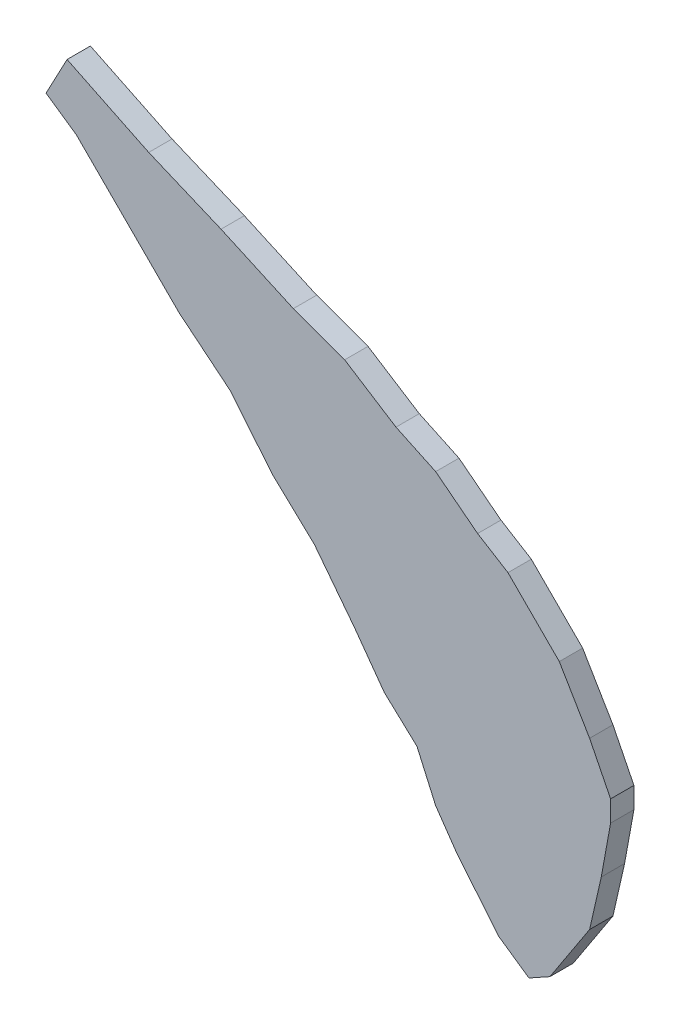
ISO-10303-21;
HEADER;
FILE_DESCRIPTION(('STEP AP214'),'2;1');
FILE_NAME('part.step','',(''),(''),'','','');
FILE_SCHEMA(('AUTOMOTIVE_DESIGN { 1 0 10303 214 1 1 1 1 }'));
ENDSEC;
DATA;
#1=APPLICATION_CONTEXT('core data for automotive mechanical design processes');
#2=APPLICATION_PROTOCOL_DEFINITION('international standard','automotive_design',2000,#1);
#3=PRODUCT_CONTEXT('',#1,'mechanical');
#4=PRODUCT('Part','Part','',(#3));
#5=PRODUCT_RELATED_PRODUCT_CATEGORY('part','',(#4));
#6=PRODUCT_DEFINITION_FORMATION('','',#4);
#7=PRODUCT_DEFINITION_CONTEXT('part definition',#1,'design');
#8=PRODUCT_DEFINITION('design','',#6,#7);
#9=PRODUCT_DEFINITION_SHAPE('','',#8);
#10=(LENGTH_UNIT() NAMED_UNIT(*) SI_UNIT(.MILLI.,.METRE.));
#11=(NAMED_UNIT(*) PLANE_ANGLE_UNIT() SI_UNIT($,.RADIAN.));
#12=(NAMED_UNIT(*) SI_UNIT($,.STERADIAN.) SOLID_ANGLE_UNIT());
#13=UNCERTAINTY_MEASURE_WITH_UNIT(LENGTH_MEASURE(1.E-05),#10,'distance_accuracy_value','');
#14=(GEOMETRIC_REPRESENTATION_CONTEXT(3) GLOBAL_UNCERTAINTY_ASSIGNED_CONTEXT((#13)) GLOBAL_UNIT_ASSIGNED_CONTEXT((#10,
#11,#12)) REPRESENTATION_CONTEXT('',''));
#15=CARTESIAN_POINT('',(0.,0.,0.));
#16=DIRECTION('',(0.,0.,1.));
#17=DIRECTION('',(1.,0.,0.));
#18=AXIS2_PLACEMENT_3D('',#15,#16,#17);
#19=CARTESIAN_POINT('',(0.,0.,0.01));
#20=DIRECTION('',(0.,0.,1.));
#21=DIRECTION('',(1.,0.,0.));
#22=AXIS2_PLACEMENT_3D('',#19,#20,#21);
#23=PLANE('',#22);
#24=DIRECTION('',(0.727013152549817,-0.686623532963716,0.));
#25=VECTOR('',#24,1.);
#26=CARTESIAN_POINT('',(-1.004,0.565,0.01));
#27=LINE('',#26,#25);
#28=CARTESIAN_POINT('',(-0.986,0.548,0.01));
#29=VERTEX_POINT('',#28);
#30=CARTESIAN_POINT('',(-1.004,0.565,0.01));
#31=VERTEX_POINT('',#30);
#32=EDGE_CURVE('E220',#29,#31,#27,.F.);
#33=ORIENTED_EDGE('',*,*,#32,.F.);
#34=DIRECTION('',(0.611447501075771,-0.791285001392163,0.));
#35=VECTOR('',#34,1.);
#36=CARTESIAN_POINT('',(-0.986,0.548,0.01));
#37=LINE('',#36,#35);
#38=CARTESIAN_POINT('',(-0.969000000000001,0.526000000000001,0.01));
#39=VERTEX_POINT('',#38);
#40=EDGE_CURVE('E20',#39,#29,#37,.F.);
#41=ORIENTED_EDGE('',*,*,#40,.F.);
#42=DIRECTION('',(0.585490553844377,-0.810679228399868,0.));
#43=VECTOR('',#42,1.);
#44=CARTESIAN_POINT('',(-0.969,0.526,0.01));
#45=LINE('',#44,#43);
#46=CARTESIAN_POINT('',(-0.956,0.508,0.01));
#47=VERTEX_POINT('',#46);
#48=EDGE_CURVE('E209',#47,#39,#45,.F.);
#49=ORIENTED_EDGE('',*,*,#48,.F.);
#50=DIRECTION('',(0.732793491626288,-0.680451099367289,0.));
#51=VECTOR('',#50,1.);
#52=CARTESIAN_POINT('',(-0.956,0.508,0.01));
#53=LINE('',#52,#51);
#54=CARTESIAN_POINT('',(-0.942,0.495,0.01));
#55=VERTEX_POINT('',#54);
#56=EDGE_CURVE('E204',#55,#47,#53,.F.);
#57=ORIENTED_EDGE('',*,*,#56,.F.);
#58=DIRECTION('',(0.406138466053392,-0.913811548620282,0.));
#59=VECTOR('',#58,1.);
#60=CARTESIAN_POINT('',(-0.942,0.495,0.01));
#61=LINE('',#60,#59);
#62=CARTESIAN_POINT('',(-0.934,0.477,0.01));
#63=VERTEX_POINT('',#62);
#64=EDGE_CURVE('E231',#63,#55,#61,.F.);
#65=ORIENTED_EDGE('',*,*,#64,.F.);
#66=DIRECTION('',(0.569209978830293,-0.822192191643789,0.));
#67=VECTOR('',#66,1.);
#68=CARTESIAN_POINT('',(-0.934,0.477,0.01));
#69=LINE('',#68,#67);
#70=CARTESIAN_POINT('',(-0.925,0.464,0.01));
#71=VERTEX_POINT('',#70);
#72=EDGE_CURVE('E235',#71,#63,#69,.F.);
#73=ORIENTED_EDGE('',*,*,#72,.F.);
#74=DIRECTION('',(0.633237790257295,-0.773957299203294,0.));
#75=VECTOR('',#74,1.);
#76=CARTESIAN_POINT('',(-0.925,0.464,0.01));
#77=LINE('',#76,#75);
#78=CARTESIAN_POINT('',(-0.907,0.442,0.01));
#79=VERTEX_POINT('',#78);
#80=EDGE_CURVE('E239',#79,#71,#77,.F.);
#81=ORIENTED_EDGE('',*,*,#80,.F.);
#82=DIRECTION('',(0.822192191643789,-0.569209978830293,0.));
#83=VECTOR('',#82,1.);
#84=CARTESIAN_POINT('',(-0.907,0.442,0.01));
#85=LINE('',#84,#83);
#86=CARTESIAN_POINT('',(-0.894,0.433,0.01));
#87=VERTEX_POINT('',#86);
#88=EDGE_CURVE('E243',#87,#79,#85,.F.);
#89=ORIENTED_EDGE('',*,*,#88,.F.);
#90=DIRECTION('',(0.874157276121542,0.485642931178624,0.));
#91=VECTOR('',#90,1.);
#92=CARTESIAN_POINT('',(-0.894,0.433,0.01));
#93=LINE('',#92,#91);
#94=CARTESIAN_POINT('',(-0.885,0.438,0.01));
#95=VERTEX_POINT('',#94);
#96=EDGE_CURVE('E247',#95,#87,#93,.F.);
#97=ORIENTED_EDGE('',*,*,#96,.F.);
#98=DIRECTION('',(0.547249362982722,0.836969613973533,0.));
#99=VECTOR('',#98,1.);
#100=CARTESIAN_POINT('',(-0.885,0.438,0.01));
#101=LINE('',#100,#99);
#102=CARTESIAN_POINT('',(-0.868,0.464,0.01));
#103=VERTEX_POINT('',#102);
#104=EDGE_CURVE('E251',#103,#95,#101,.F.);
#105=ORIENTED_EDGE('',*,*,#104,.F.);
#106=DIRECTION('',(0.22162110358899,0.975132855791455,0.));
#107=VECTOR('',#106,1.);
#108=CARTESIAN_POINT('',(-0.868,0.464,0.01));
#109=LINE('',#108,#107);
#110=CARTESIAN_POINT('',(-0.863,0.486,0.01));
#111=VERTEX_POINT('',#110);
#112=EDGE_CURVE('E255',#111,#103,#109,.F.);
#113=ORIENTED_EDGE('',*,*,#112,.F.);
#114=DIRECTION('',(0.178885438200001,0.983869910099904,0.));
#115=VECTOR('',#114,1.);
#116=CARTESIAN_POINT('',(-0.863,0.486,0.01));
#117=LINE('',#116,#115);
#118=CARTESIAN_POINT('',(-0.859,0.508,0.01));
#119=VERTEX_POINT('',#118);
#120=EDGE_CURVE('E259',#119,#111,#117,.F.);
#121=ORIENTED_EDGE('',*,*,#120,.F.);
#122=DIRECTION('',(0.,1.,0.));
#123=VECTOR('',#122,1.);
#124=CARTESIAN_POINT('',(-0.859,0.508,0.01));
#125=LINE('',#124,#123);
#126=CARTESIAN_POINT('',(-0.859,0.517,0.01));
#127=VERTEX_POINT('',#126);
#128=EDGE_CURVE('E263',#127,#119,#125,.F.);
#129=ORIENTED_EDGE('',*,*,#128,.F.);
#130=DIRECTION('',(-0.447213595499998,0.894427190999896,0.));
#131=VECTOR('',#130,1.);
#132=CARTESIAN_POINT('',(-0.859,0.517,0.01));
#133=LINE('',#132,#131);
#134=CARTESIAN_POINT('',(-0.868,0.535,0.01));
#135=VERTEX_POINT('',#134);
#136=EDGE_CURVE('E267',#135,#127,#133,.F.);
#137=ORIENTED_EDGE('',*,*,#136,.F.);
#138=DIRECTION('',(-0.508729312126617,0.860926528214329,0.));
#139=VECTOR('',#138,1.);
#140=CARTESIAN_POINT('',(-0.868,0.535,0.01));
#141=LINE('',#140,#139);
#142=CARTESIAN_POINT('',(-0.881,0.557,0.01));
#143=VERTEX_POINT('',#142);
#144=EDGE_CURVE('E271',#143,#135,#141,.F.);
#145=ORIENTED_EDGE('',*,*,#144,.F.);
#146=DIRECTION('',(-0.707106781186548,0.707106781186548,0.));
#147=VECTOR('',#146,1.);
#148=CARTESIAN_POINT('',(-0.881,0.557,0.01));
#149=LINE('',#148,#147);
#150=CARTESIAN_POINT('',(-0.903,0.579,0.01));
#151=VERTEX_POINT('',#150);
#152=EDGE_CURVE('E275',#151,#143,#149,.F.);
#153=ORIENTED_EDGE('',*,*,#152,.F.);
#154=DIRECTION('',(-0.851658316704547,0.524097425664329,0.));
#155=VECTOR('',#154,1.);
#156=CARTESIAN_POINT('',(-0.903,0.579,0.01));
#157=LINE('',#156,#155);
#158=CARTESIAN_POINT('',(-0.916,0.587,0.01));
#159=VERTEX_POINT('',#158);
#160=EDGE_CURVE('E279',#159,#151,#157,.F.);
#161=ORIENTED_EDGE('',*,*,#160,.F.);
#162=DIRECTION('',(-0.789352217376326,0.61394061351492,0.));
#163=VECTOR('',#162,1.);
#164=CARTESIAN_POINT('',(-0.916,0.587,0.01));
#165=LINE('',#164,#163);
#166=CARTESIAN_POINT('',(-0.934,0.601,0.01));
#167=VERTEX_POINT('',#166);
#168=EDGE_CURVE('E283',#167,#159,#165,.F.);
#169=ORIENTED_EDGE('',*,*,#168,.F.);
#170=DIRECTION('',(-0.904818702200987,0.425797036329894,0.));
#171=VECTOR('',#170,1.);
#172=CARTESIAN_POINT('',(-0.934,0.601,0.01));
#173=LINE('',#172,#171);
#174=CARTESIAN_POINT('',(-0.951,0.609,0.01));
#175=VERTEX_POINT('',#174);
#176=EDGE_CURVE('E287',#175,#167,#173,.F.);
#177=ORIENTED_EDGE('',*,*,#176,.F.);
#178=DIRECTION('',(-0.843661487732087,0.536875492193192,0.));
#179=VECTOR('',#178,1.);
#180=CARTESIAN_POINT('',(-0.951,0.609,0.01));
#181=LINE('',#180,#179);
#182=CARTESIAN_POINT('',(-0.973,0.623,0.01));
#183=VERTEX_POINT('',#182);
#184=EDGE_CURVE('E291',#183,#175,#181,.F.);
#185=ORIENTED_EDGE('',*,*,#184,.F.);
#186=DIRECTION('',(-0.939793423488434,0.341743063086712,0.));
#187=VECTOR('',#186,1.);
#188=CARTESIAN_POINT('',(-0.973,0.623,0.01));
#189=LINE('',#188,#187);
#190=CARTESIAN_POINT('',(-0.995,0.631,0.01));
#191=VERTEX_POINT('',#190);
#192=EDGE_CURVE('E295',#191,#183,#189,.F.);
#193=ORIENTED_EDGE('',*,*,#192,.F.);
#194=DIRECTION('',(-0.911370599658679,0.41158672242649,0.));
#195=VECTOR('',#194,1.);
#196=CARTESIAN_POINT('',(-0.995,0.631,0.01));
#197=LINE('',#196,#195);
#198=CARTESIAN_POINT('',(-1.02600000000001,0.645000000000003,0.01));
#199=VERTEX_POINT('',#198);
#200=EDGE_CURVE('E299',#199,#191,#197,.F.);
#201=ORIENTED_EDGE('',*,*,#200,.F.);
#202=DIRECTION('',(-0.922194381828517,0.386726676250707,0.));
#203=VECTOR('',#202,1.);
#204=CARTESIAN_POINT('',(-1.026,0.645,0.01));
#205=LINE('',#204,#203);
#206=CARTESIAN_POINT('',(-1.057,0.657999999999999,0.01));
#207=VERTEX_POINT('',#206);
#208=EDGE_CURVE('E303',#207,#199,#205,.F.);
#209=ORIENTED_EDGE('',*,*,#208,.F.);
#210=DIRECTION('',(-0.899508158576003,0.436903962736902,0.));
#211=VECTOR('',#210,1.);
#212=CARTESIAN_POINT('',(-1.057,0.658,0.01));
#213=LINE('',#212,#211);
#214=CARTESIAN_POINT('',(-1.092,0.675,0.01));
#215=VERTEX_POINT('',#214);
#216=EDGE_CURVE('E307',#215,#207,#213,.F.);
#217=ORIENTED_EDGE('',*,*,#216,.F.);
#218=DIRECTION('',(-0.467887720418991,-0.883787916347084,0.));
#219=VECTOR('',#218,1.);
#220=CARTESIAN_POINT('',(-1.092,0.675,0.01));
#221=LINE('',#220,#219);
#222=CARTESIAN_POINT('',(-1.101,0.658,0.01));
#223=VERTEX_POINT('',#222);
#224=EDGE_CURVE('E311',#223,#215,#221,.F.);
#225=ORIENTED_EDGE('',*,*,#224,.F.);
#226=DIRECTION('',(0.822192191643789,-0.569209978830293,0.));
#227=VECTOR('',#226,1.);
#228=CARTESIAN_POINT('',(-1.101,0.658,0.01));
#229=LINE('',#228,#227);
#230=CARTESIAN_POINT('',(-1.088,0.649,0.01));
#231=VERTEX_POINT('',#230);
#232=EDGE_CURVE('E315',#231,#223,#229,.F.);
#233=ORIENTED_EDGE('',*,*,#232,.F.);
#234=DIRECTION('',(0.707106781186548,-0.707106781186548,0.));
#235=VECTOR('',#234,1.);
#236=CARTESIAN_POINT('',(-1.088,0.649,0.01));
#237=LINE('',#236,#235);
#238=CARTESIAN_POINT('',(-1.044,0.605,0.01));
#239=VERTEX_POINT('',#238);
#240=EDGE_CURVE('E319',#239,#231,#237,.F.);
#241=ORIENTED_EDGE('',*,*,#240,.F.);
#242=DIRECTION('',(0.773957299203294,-0.633237790257295,0.));
#243=VECTOR('',#242,1.);
#244=CARTESIAN_POINT('',(-1.044,0.605,0.01));
#245=LINE('',#244,#243);
#246=CARTESIAN_POINT('',(-1.022,0.587,0.01));
#247=VERTEX_POINT('',#246);
#248=EDGE_CURVE('E323',#247,#239,#245,.F.);
#249=ORIENTED_EDGE('',*,*,#248,.F.);
#250=DIRECTION('',(0.633237790257295,-0.773957299203294,0.));
#251=VECTOR('',#250,1.);
#252=CARTESIAN_POINT('',(-1.022,0.587,0.01));
#253=LINE('',#252,#251);
#254=EDGE_CURVE('E327',#31,#247,#253,.F.);
#255=ORIENTED_EDGE('',*,*,#254,.F.);
#256=EDGE_LOOP('',(#33,#41,#49,#57,#65,#73,#81,#89,#97,#105,#113,#121,#129,#137,#145,#153,#161,
#169,#177,#185,#193,#201,#209,#217,#225,#233,#241,#249,#255));
#257=FACE_BOUND('',#256,.T.);
#258=ADVANCED_FACE('F17',(#257),#23,.T.);
#259=CARTESIAN_POINT('',(-0.986,0.548,0.));
#260=DIRECTION('',(-0.791285001392163,-0.611447501075771,0.));
#261=DIRECTION('',(0.611447501075771,-0.791285001392163,0.));
#262=AXIS2_PLACEMENT_3D('',#259,#260,#261);
#263=PLANE('',#262);
#264=DIRECTION('',(0.,0.,1.));
#265=VECTOR('',#264,1.);
#266=CARTESIAN_POINT('',(-0.986,0.548,0.));
#267=LINE('',#266,#265);
#268=CARTESIAN_POINT('',(-0.986,0.548,0.));
#269=VERTEX_POINT('',#268);
#270=EDGE_CURVE('E331',#269,#29,#267,.T.);
#271=ORIENTED_EDGE('',*,*,#270,.F.);
#272=DIRECTION('',(0.611447501075766,-0.791285001392167,0.));
#273=VECTOR('',#272,1.);
#274=CARTESIAN_POINT('',(-0.986,0.548,0.));
#275=LINE('',#274,#273);
#276=CARTESIAN_POINT('',(-0.969,0.526000000000001,0.));
#277=VERTEX_POINT('',#276);
#278=EDGE_CURVE('E226',#269,#277,#275,.T.);
#279=ORIENTED_EDGE('',*,*,#278,.T.);
#280=DIRECTION('',(0.,0.,1.));
#281=VECTOR('',#280,1.);
#282=CARTESIAN_POINT('',(-0.969,0.526,0.));
#283=LINE('',#282,#281);
#284=EDGE_CURVE('E214',#39,#277,#283,.F.);
#285=ORIENTED_EDGE('',*,*,#284,.F.);
#286=ORIENTED_EDGE('',*,*,#40,.T.);
#287=EDGE_LOOP('',(#271,#279,#285,#286));
#288=FACE_BOUND('',#287,.T.);
#289=ADVANCED_FACE('F225',(#288),#263,.T.);
#290=CARTESIAN_POINT('',(-0.969,0.526,0.));
#291=DIRECTION('',(-0.810679228399868,-0.585490553844377,0.));
#292=DIRECTION('',(0.585490553844377,-0.810679228399868,0.));
#293=AXIS2_PLACEMENT_3D('',#290,#291,#292);
#294=PLANE('',#293);
#295=ORIENTED_EDGE('',*,*,#284,.T.);
#296=DIRECTION('',(0.585490553844361,-0.810679228399879,0.));
#297=VECTOR('',#296,1.);
#298=CARTESIAN_POINT('',(-0.969,0.526,0.));
#299=LINE('',#298,#297);
#300=CARTESIAN_POINT('',(-0.956,0.508,0.));
#301=VERTEX_POINT('',#300);
#302=EDGE_CURVE('E336',#277,#301,#299,.T.);
#303=ORIENTED_EDGE('',*,*,#302,.T.);
#304=DIRECTION('',(0.,0.,1.));
#305=VECTOR('',#304,1.);
#306=CARTESIAN_POINT('',(-0.956,0.508,0.));
#307=LINE('',#306,#305);
#308=EDGE_CURVE('E216',#47,#301,#307,.F.);
#309=ORIENTED_EDGE('',*,*,#308,.F.);
#310=ORIENTED_EDGE('',*,*,#48,.T.);
#311=EDGE_LOOP('',(#295,#303,#309,#310));
#312=FACE_BOUND('',#311,.T.);
#313=ADVANCED_FACE('F211',(#312),#294,.T.);
#314=CARTESIAN_POINT('',(-0.956,0.508,0.));
#315=DIRECTION('',(-0.680451099367289,-0.732793491626288,0.));
#316=DIRECTION('',(0.732793491626288,-0.680451099367289,0.));
#317=AXIS2_PLACEMENT_3D('',#314,#315,#316);
#318=PLANE('',#317);
#319=ORIENTED_EDGE('',*,*,#308,.T.);
#320=DIRECTION('',(0.732793491626297,-0.68045109936728,0.));
#321=VECTOR('',#320,1.);
#322=CARTESIAN_POINT('',(-0.956,0.508,0.));
#323=LINE('',#322,#321);
#324=CARTESIAN_POINT('',(-0.942,0.495,0.));
#325=VERTEX_POINT('',#324);
#326=EDGE_CURVE('E338',#301,#325,#323,.T.);
#327=ORIENTED_EDGE('',*,*,#326,.T.);
#328=DIRECTION('',(0.,0.,1.));
#329=VECTOR('',#328,1.);
#330=CARTESIAN_POINT('',(-0.942,0.495,0.));
#331=LINE('',#330,#329);
#332=EDGE_CURVE('E233',#55,#325,#331,.F.);
#333=ORIENTED_EDGE('',*,*,#332,.F.);
#334=ORIENTED_EDGE('',*,*,#56,.T.);
#335=EDGE_LOOP('',(#319,#327,#333,#334));
#336=FACE_BOUND('',#335,.T.);
#337=ADVANCED_FACE('F540',(#336),#318,.T.);
#338=CARTESIAN_POINT('',(-0.942,0.495,0.));
#339=DIRECTION('',(-0.913811548620282,-0.406138466053392,0.));
#340=DIRECTION('',(0.406138466053392,-0.913811548620282,0.));
#341=AXIS2_PLACEMENT_3D('',#338,#339,#340);
#342=PLANE('',#341);
#343=ORIENTED_EDGE('',*,*,#332,.T.);
#344=DIRECTION('',(0.406138466053447,-0.913811548620258,0.));
#345=VECTOR('',#344,1.);
#346=CARTESIAN_POINT('',(-0.942,0.495,0.));
#347=LINE('',#346,#345);
#348=CARTESIAN_POINT('',(-0.934000000000001,0.477,0.));
#349=VERTEX_POINT('',#348);
#350=EDGE_CURVE('E341',#325,#349,#347,.T.);
#351=ORIENTED_EDGE('',*,*,#350,.T.);
#352=DIRECTION('',(0.,0.,1.));
#353=VECTOR('',#352,1.);
#354=CARTESIAN_POINT('',(-0.934,0.477,0.));
#355=LINE('',#354,#353);
#356=EDGE_CURVE('E237',#63,#349,#355,.F.);
#357=ORIENTED_EDGE('',*,*,#356,.F.);
#358=ORIENTED_EDGE('',*,*,#64,.T.);
#359=EDGE_LOOP('',(#343,#351,#357,#358));
#360=FACE_BOUND('',#359,.T.);
#361=ADVANCED_FACE('F538',(#360),#342,.T.);
#362=CARTESIAN_POINT('',(-0.934,0.477,0.));
#363=DIRECTION('',(-0.822192191643789,-0.569209978830293,0.));
#364=DIRECTION('',(0.569209978830293,-0.822192191643789,0.));
#365=AXIS2_PLACEMENT_3D('',#362,#363,#364);
#366=PLANE('',#365);
#367=ORIENTED_EDGE('',*,*,#356,.T.);
#368=DIRECTION('',(0.56920997883031,-0.822192191643777,0.));
#369=VECTOR('',#368,1.);
#370=CARTESIAN_POINT('',(-0.934,0.477,0.));
#371=LINE('',#370,#369);
#372=CARTESIAN_POINT('',(-0.925,0.464,0.));
#373=VERTEX_POINT('',#372);
#374=EDGE_CURVE('E344',#349,#373,#371,.T.);
#375=ORIENTED_EDGE('',*,*,#374,.T.);
#376=DIRECTION('',(0.,0.,1.));
#377=VECTOR('',#376,1.);
#378=CARTESIAN_POINT('',(-0.925,0.464,0.));
#379=LINE('',#378,#377);
#380=EDGE_CURVE('E241',#71,#373,#379,.F.);
#381=ORIENTED_EDGE('',*,*,#380,.F.);
#382=ORIENTED_EDGE('',*,*,#72,.T.);
#383=EDGE_LOOP('',(#367,#375,#381,#382));
#384=FACE_BOUND('',#383,.T.);
#385=ADVANCED_FACE('F534',(#384),#366,.T.);
#386=CARTESIAN_POINT('',(-0.925,0.464,0.));
#387=DIRECTION('',(-0.773957299203294,-0.633237790257295,0.));
#388=DIRECTION('',(0.633237790257295,-0.773957299203294,0.));
#389=AXIS2_PLACEMENT_3D('',#386,#387,#388);
#390=PLANE('',#389);
#391=ORIENTED_EDGE('',*,*,#380,.T.);
#392=DIRECTION('',(0.633237790257262,-0.773957299203322,0.));
#393=VECTOR('',#392,1.);
#394=CARTESIAN_POINT('',(-0.925,0.464,0.));
#395=LINE('',#394,#393);
#396=CARTESIAN_POINT('',(-0.907,0.442,0.));
#397=VERTEX_POINT('',#396);
#398=EDGE_CURVE('E347',#373,#397,#395,.T.);
#399=ORIENTED_EDGE('',*,*,#398,.T.);
#400=DIRECTION('',(0.,0.,1.));
#401=VECTOR('',#400,1.);
#402=CARTESIAN_POINT('',(-0.907,0.442,0.));
#403=LINE('',#402,#401);
#404=EDGE_CURVE('E245',#79,#397,#403,.F.);
#405=ORIENTED_EDGE('',*,*,#404,.F.);
#406=ORIENTED_EDGE('',*,*,#80,.T.);
#407=EDGE_LOOP('',(#391,#399,#405,#406));
#408=FACE_BOUND('',#407,.T.);
#409=ADVANCED_FACE('F528',(#408),#390,.T.);
#410=CARTESIAN_POINT('',(-0.907,0.442,0.));
#411=DIRECTION('',(-0.569209978830293,-0.822192191643789,0.));
#412=DIRECTION('',(0.822192191643789,-0.569209978830293,0.));
#413=AXIS2_PLACEMENT_3D('',#410,#411,#412);
#414=PLANE('',#413);
#415=ORIENTED_EDGE('',*,*,#404,.T.);
#416=DIRECTION('',(0.822192191643778,-0.569209978830309,0.));
#417=VECTOR('',#416,1.);
#418=CARTESIAN_POINT('',(-0.907,0.442,0.));
#419=LINE('',#418,#417);
#420=CARTESIAN_POINT('',(-0.894,0.433,0.));
#421=VERTEX_POINT('',#420);
#422=EDGE_CURVE('E350',#397,#421,#419,.T.);
#423=ORIENTED_EDGE('',*,*,#422,.T.);
#424=DIRECTION('',(0.,0.,1.));
#425=VECTOR('',#424,1.);
#426=CARTESIAN_POINT('',(-0.894,0.433,0.));
#427=LINE('',#426,#425);
#428=EDGE_CURVE('E249',#87,#421,#427,.F.);
#429=ORIENTED_EDGE('',*,*,#428,.F.);
#430=ORIENTED_EDGE('',*,*,#88,.T.);
#431=EDGE_LOOP('',(#415,#423,#429,#430));
#432=FACE_BOUND('',#431,.T.);
#433=ADVANCED_FACE('F524',(#432),#414,.T.);
#434=CARTESIAN_POINT('',(-0.894,0.433,0.));
#435=DIRECTION('',(0.485642931178624,-0.874157276121542,0.));
#436=DIRECTION('',(0.874157276121542,0.485642931178624,0.));
#437=AXIS2_PLACEMENT_3D('',#434,#435,#436);
#438=PLANE('',#437);
#439=ORIENTED_EDGE('',*,*,#428,.T.);
#440=DIRECTION('',(0.874157276121537,0.485642931178633,0.));
#441=VECTOR('',#440,1.);
#442=CARTESIAN_POINT('',(-0.894,0.433,0.));
#443=LINE('',#442,#441);
#444=CARTESIAN_POINT('',(-0.885,0.438,0.));
#445=VERTEX_POINT('',#444);
#446=EDGE_CURVE('E353',#421,#445,#443,.T.);
#447=ORIENTED_EDGE('',*,*,#446,.T.);
#448=DIRECTION('',(0.,0.,1.));
#449=VECTOR('',#448,1.);
#450=CARTESIAN_POINT('',(-0.885,0.438,0.));
#451=LINE('',#450,#449);
#452=EDGE_CURVE('E253',#95,#445,#451,.F.);
#453=ORIENTED_EDGE('',*,*,#452,.F.);
#454=ORIENTED_EDGE('',*,*,#96,.T.);
#455=EDGE_LOOP('',(#439,#447,#453,#454));
#456=FACE_BOUND('',#455,.T.);
#457=ADVANCED_FACE('F518',(#456),#438,.T.);
#458=CARTESIAN_POINT('',(-0.885,0.438,0.));
#459=DIRECTION('',(0.836969613973533,-0.547249362982722,0.));
#460=DIRECTION('',(0.547249362982722,0.836969613973533,0.));
#461=AXIS2_PLACEMENT_3D('',#458,#459,#460);
#462=PLANE('',#461);
#463=ORIENTED_EDGE('',*,*,#452,.T.);
#464=DIRECTION('',(0.547249362982702,0.836969613973546,0.));
#465=VECTOR('',#464,1.);
#466=CARTESIAN_POINT('',(-0.885,0.438,0.));
#467=LINE('',#466,#465);
#468=CARTESIAN_POINT('',(-0.868,0.464,0.));
#469=VERTEX_POINT('',#468);
#470=EDGE_CURVE('E356',#445,#469,#467,.T.);
#471=ORIENTED_EDGE('',*,*,#470,.T.);
#472=DIRECTION('',(0.,0.,1.));
#473=VECTOR('',#472,1.);
#474=CARTESIAN_POINT('',(-0.868,0.464,0.));
#475=LINE('',#474,#473);
#476=EDGE_CURVE('E257',#103,#469,#475,.F.);
#477=ORIENTED_EDGE('',*,*,#476,.F.);
#478=ORIENTED_EDGE('',*,*,#104,.T.);
#479=EDGE_LOOP('',(#463,#471,#477,#478));
#480=FACE_BOUND('',#479,.T.);
#481=ADVANCED_FACE('F514',(#480),#462,.T.);
#482=CARTESIAN_POINT('',(-0.868,0.464,0.));
#483=DIRECTION('',(0.975132855791455,-0.22162110358899,0.));
#484=DIRECTION('',(0.22162110358899,0.975132855791455,0.));
#485=AXIS2_PLACEMENT_3D('',#482,#483,#484);
#486=PLANE('',#485);
#487=ORIENTED_EDGE('',*,*,#476,.T.);
#488=DIRECTION('',(0.221621103588969,0.975132855791459,0.));
#489=VECTOR('',#488,1.);
#490=CARTESIAN_POINT('',(-0.868,0.464,0.));
#491=LINE('',#490,#489);
#492=CARTESIAN_POINT('',(-0.863,0.486,0.));
#493=VERTEX_POINT('',#492);
#494=EDGE_CURVE('E359',#469,#493,#491,.T.);
#495=ORIENTED_EDGE('',*,*,#494,.T.);
#496=DIRECTION('',(0.,0.,1.));
#497=VECTOR('',#496,1.);
#498=CARTESIAN_POINT('',(-0.863,0.486,0.));
#499=LINE('',#498,#497);
#500=EDGE_CURVE('E261',#111,#493,#499,.F.);
#501=ORIENTED_EDGE('',*,*,#500,.F.);
#502=ORIENTED_EDGE('',*,*,#112,.T.);
#503=EDGE_LOOP('',(#487,#495,#501,#502));
#504=FACE_BOUND('',#503,.T.);
#505=ADVANCED_FACE('F508',(#504),#486,.T.);
#506=CARTESIAN_POINT('',(-0.863,0.486,0.));
#507=DIRECTION('',(0.983869910099904,-0.178885438200001,0.));
#508=DIRECTION('',(0.178885438200001,0.983869910099904,0.));
#509=AXIS2_PLACEMENT_3D('',#506,#507,#508);
#510=PLANE('',#509);
#511=ORIENTED_EDGE('',*,*,#500,.T.);
#512=DIRECTION('',(0.178885438199987,0.983869910099907,0.));
#513=VECTOR('',#512,1.);
#514=CARTESIAN_POINT('',(-0.863,0.486,0.));
#515=LINE('',#514,#513);
#516=CARTESIAN_POINT('',(-0.859,0.508,0.));
#517=VERTEX_POINT('',#516);
#518=EDGE_CURVE('E362',#493,#517,#515,.T.);
#519=ORIENTED_EDGE('',*,*,#518,.T.);
#520=DIRECTION('',(0.,0.,-1.));
#521=VECTOR('',#520,1.);
#522=CARTESIAN_POINT('',(-0.859,0.508,0.));
#523=LINE('',#522,#521);
#524=EDGE_CURVE('E265',#119,#517,#523,.T.);
#525=ORIENTED_EDGE('',*,*,#524,.F.);
#526=ORIENTED_EDGE('',*,*,#120,.T.);
#527=EDGE_LOOP('',(#511,#519,#525,#526));
#528=FACE_BOUND('',#527,.T.);
#529=ADVANCED_FACE('F504',(#528),#510,.T.);
#530=CARTESIAN_POINT('',(-0.859,0.508,0.));
#531=DIRECTION('',(1.,0.,0.));
#532=DIRECTION('',(0.,0.,-1.));
#533=AXIS2_PLACEMENT_3D('',#530,#531,#532);
#534=PLANE('',#533);
#535=ORIENTED_EDGE('',*,*,#524,.T.);
#536=DIRECTION('',(0.,1.,0.));
#537=VECTOR('',#536,1.);
#538=CARTESIAN_POINT('',(-0.859,0.,0.));
#539=LINE('',#538,#537);
#540=CARTESIAN_POINT('',(-0.859,0.517,0.));
#541=VERTEX_POINT('',#540);
#542=EDGE_CURVE('E365',#517,#541,#539,.T.);
#543=ORIENTED_EDGE('',*,*,#542,.T.);
#544=DIRECTION('',(0.,0.,1.));
#545=VECTOR('',#544,1.);
#546=CARTESIAN_POINT('',(-0.859,0.517,0.));
#547=LINE('',#546,#545);
#548=EDGE_CURVE('E269',#127,#541,#547,.F.);
#549=ORIENTED_EDGE('',*,*,#548,.F.);
#550=ORIENTED_EDGE('',*,*,#128,.T.);
#551=EDGE_LOOP('',(#535,#543,#549,#550));
#552=FACE_BOUND('',#551,.T.);
#553=ADVANCED_FACE('F498',(#552),#534,.T.);
#554=CARTESIAN_POINT('',(-0.859,0.517,0.));
#555=DIRECTION('',(0.894427190999896,0.447213595499998,0.));
#556=DIRECTION('',(-0.447213595499998,0.894427190999896,0.));
#557=AXIS2_PLACEMENT_3D('',#554,#555,#556);
#558=PLANE('',#557);
#559=ORIENTED_EDGE('',*,*,#548,.T.);
#560=DIRECTION('',(-0.447213595499962,0.894427190999914,0.));
#561=VECTOR('',#560,1.);
#562=CARTESIAN_POINT('',(-0.859,0.517,0.));
#563=LINE('',#562,#561);
#564=CARTESIAN_POINT('',(-0.868,0.535,0.));
#565=VERTEX_POINT('',#564);
#566=EDGE_CURVE('E368',#541,#565,#563,.T.);
#567=ORIENTED_EDGE('',*,*,#566,.T.);
#568=DIRECTION('',(0.,0.,1.));
#569=VECTOR('',#568,1.);
#570=CARTESIAN_POINT('',(-0.868,0.535,0.));
#571=LINE('',#570,#569);
#572=EDGE_CURVE('E273',#135,#565,#571,.F.);
#573=ORIENTED_EDGE('',*,*,#572,.F.);
#574=ORIENTED_EDGE('',*,*,#136,.T.);
#575=EDGE_LOOP('',(#559,#567,#573,#574));
#576=FACE_BOUND('',#575,.T.);
#577=ADVANCED_FACE('F494',(#576),#558,.T.);
#578=CARTESIAN_POINT('',(-0.868,0.535,0.));
#579=DIRECTION('',(0.860926528214329,0.508729312126617,0.));
#580=DIRECTION('',(-0.508729312126617,0.860926528214329,0.));
#581=AXIS2_PLACEMENT_3D('',#578,#579,#580);
#582=PLANE('',#581);
#583=ORIENTED_EDGE('',*,*,#572,.T.);
#584=DIRECTION('',(-0.508729312126639,0.860926528214317,0.));
#585=VECTOR('',#584,1.);
#586=CARTESIAN_POINT('',(-0.868,0.535,0.));
#587=LINE('',#586,#585);
#588=CARTESIAN_POINT('',(-0.881,0.557,0.));
#589=VERTEX_POINT('',#588);
#590=EDGE_CURVE('E371',#565,#589,#587,.T.);
#591=ORIENTED_EDGE('',*,*,#590,.T.);
#592=DIRECTION('',(0.,0.,1.));
#593=VECTOR('',#592,1.);
#594=CARTESIAN_POINT('',(-0.881,0.557,0.));
#595=LINE('',#594,#593);
#596=EDGE_CURVE('E277',#143,#589,#595,.F.);
#597=ORIENTED_EDGE('',*,*,#596,.F.);
#598=ORIENTED_EDGE('',*,*,#144,.T.);
#599=EDGE_LOOP('',(#583,#591,#597,#598));
#600=FACE_BOUND('',#599,.T.);
#601=ADVANCED_FACE('F488',(#600),#582,.T.);
#602=CARTESIAN_POINT('',(-0.881,0.557,0.));
#603=DIRECTION('',(0.707106781186548,0.707106781186548,0.));
#604=DIRECTION('',(-0.707106781186548,0.707106781186548,0.));
#605=AXIS2_PLACEMENT_3D('',#602,#603,#604);
#606=PLANE('',#605);
#607=ORIENTED_EDGE('',*,*,#596,.T.);
#608=DIRECTION('',(-0.707106781186549,0.707106781186546,0.));
#609=VECTOR('',#608,1.);
#610=CARTESIAN_POINT('',(-0.881,0.557,0.));
#611=LINE('',#610,#609);
#612=CARTESIAN_POINT('',(-0.903,0.579,0.));
#613=VERTEX_POINT('',#612);
#614=EDGE_CURVE('E374',#589,#613,#611,.T.);
#615=ORIENTED_EDGE('',*,*,#614,.T.);
#616=DIRECTION('',(0.,0.,1.));
#617=VECTOR('',#616,1.);
#618=CARTESIAN_POINT('',(-0.903,0.579,0.));
#619=LINE('',#618,#617);
#620=EDGE_CURVE('E281',#151,#613,#619,.F.);
#621=ORIENTED_EDGE('',*,*,#620,.F.);
#622=ORIENTED_EDGE('',*,*,#152,.T.);
#623=EDGE_LOOP('',(#607,#615,#621,#622));
#624=FACE_BOUND('',#623,.T.);
#625=ADVANCED_FACE('F484',(#624),#606,.T.);
#626=CARTESIAN_POINT('',(-0.903,0.579,0.));
#627=DIRECTION('',(0.524097425664329,0.851658316704547,0.));
#628=DIRECTION('',(-0.851658316704547,0.524097425664329,0.));
#629=AXIS2_PLACEMENT_3D('',#626,#627,#628);
#630=PLANE('',#629);
#631=ORIENTED_EDGE('',*,*,#620,.T.);
#632=DIRECTION('',(-0.851658316704545,0.524097425664334,0.));
#633=VECTOR('',#632,1.);
#634=CARTESIAN_POINT('',(-0.903,0.579,0.));
#635=LINE('',#634,#633);
#636=CARTESIAN_POINT('',(-0.916,0.587,0.));
#637=VERTEX_POINT('',#636);
#638=EDGE_CURVE('E377',#613,#637,#635,.T.);
#639=ORIENTED_EDGE('',*,*,#638,.T.);
#640=DIRECTION('',(0.,0.,1.));
#641=VECTOR('',#640,1.);
#642=CARTESIAN_POINT('',(-0.916,0.587,0.));
#643=LINE('',#642,#641);
#644=EDGE_CURVE('E285',#159,#637,#643,.F.);
#645=ORIENTED_EDGE('',*,*,#644,.F.);
#646=ORIENTED_EDGE('',*,*,#160,.T.);
#647=EDGE_LOOP('',(#631,#639,#645,#646));
#648=FACE_BOUND('',#647,.T.);
#649=ADVANCED_FACE('F478',(#648),#630,.T.);
#650=CARTESIAN_POINT('',(-0.916,0.587,0.));
#651=DIRECTION('',(0.61394061351492,0.789352217376326,0.));
#652=DIRECTION('',(-0.789352217376326,0.61394061351492,0.));
#653=AXIS2_PLACEMENT_3D('',#650,#651,#652);
#654=PLANE('',#653);
#655=ORIENTED_EDGE('',*,*,#644,.T.);
#656=DIRECTION('',(-0.789352217376326,0.613940613514921,0.));
#657=VECTOR('',#656,1.);
#658=CARTESIAN_POINT('',(-0.916,0.587,0.));
#659=LINE('',#658,#657);
#660=CARTESIAN_POINT('',(-0.934,0.601,0.));
#661=VERTEX_POINT('',#660);
#662=EDGE_CURVE('E380',#637,#661,#659,.T.);
#663=ORIENTED_EDGE('',*,*,#662,.T.);
#664=DIRECTION('',(0.,0.,1.));
#665=VECTOR('',#664,1.);
#666=CARTESIAN_POINT('',(-0.934,0.601,0.));
#667=LINE('',#666,#665);
#668=EDGE_CURVE('E289',#167,#661,#667,.F.);
#669=ORIENTED_EDGE('',*,*,#668,.F.);
#670=ORIENTED_EDGE('',*,*,#168,.T.);
#671=EDGE_LOOP('',(#655,#663,#669,#670));
#672=FACE_BOUND('',#671,.T.);
#673=ADVANCED_FACE('F474',(#672),#654,.T.);
#674=CARTESIAN_POINT('',(-0.934,0.601,0.));
#675=DIRECTION('',(0.425797036329894,0.904818702200987,0.));
#676=DIRECTION('',(-0.904818702200987,0.425797036329894,0.));
#677=AXIS2_PLACEMENT_3D('',#674,#675,#676);
#678=PLANE('',#677);
#679=ORIENTED_EDGE('',*,*,#668,.T.);
#680=DIRECTION('',(-0.904818702200994,0.425797036329879,0.));
#681=VECTOR('',#680,1.);
#682=CARTESIAN_POINT('',(-0.934,0.601,0.));
#683=LINE('',#682,#681);
#684=CARTESIAN_POINT('',(-0.951,0.609,0.));
#685=VERTEX_POINT('',#684);
#686=EDGE_CURVE('E383',#661,#685,#683,.T.);
#687=ORIENTED_EDGE('',*,*,#686,.T.);
#688=DIRECTION('',(0.,0.,1.));
#689=VECTOR('',#688,1.);
#690=CARTESIAN_POINT('',(-0.951,0.609,0.));
#691=LINE('',#690,#689);
#692=EDGE_CURVE('E293',#175,#685,#691,.F.);
#693=ORIENTED_EDGE('',*,*,#692,.F.);
#694=ORIENTED_EDGE('',*,*,#176,.T.);
#695=EDGE_LOOP('',(#679,#687,#693,#694));
#696=FACE_BOUND('',#695,.T.);
#697=ADVANCED_FACE('F468',(#696),#678,.T.);
#698=CARTESIAN_POINT('',(-0.951,0.609,0.));
#699=DIRECTION('',(0.536875492193192,0.843661487732087,0.));
#700=DIRECTION('',(-0.843661487732087,0.536875492193192,0.));
#701=AXIS2_PLACEMENT_3D('',#698,#699,#700);
#702=PLANE('',#701);
#703=ORIENTED_EDGE('',*,*,#692,.T.);
#704=DIRECTION('',(-0.843661487732107,0.53687549219316,0.));
#705=VECTOR('',#704,1.);
#706=CARTESIAN_POINT('',(-0.951,0.609,0.));
#707=LINE('',#706,#705);
#708=CARTESIAN_POINT('',(-0.973,0.623,0.));
#709=VERTEX_POINT('',#708);
#710=EDGE_CURVE('E386',#685,#709,#707,.T.);
#711=ORIENTED_EDGE('',*,*,#710,.T.);
#712=DIRECTION('',(0.,0.,1.));
#713=VECTOR('',#712,1.);
#714=CARTESIAN_POINT('',(-0.973,0.623,0.));
#715=LINE('',#714,#713);
#716=EDGE_CURVE('E297',#183,#709,#715,.F.);
#717=ORIENTED_EDGE('',*,*,#716,.F.);
#718=ORIENTED_EDGE('',*,*,#184,.T.);
#719=EDGE_LOOP('',(#703,#711,#717,#718));
#720=FACE_BOUND('',#719,.T.);
#721=ADVANCED_FACE('F464',(#720),#702,.T.);
#722=CARTESIAN_POINT('',(-0.973,0.623,0.));
#723=DIRECTION('',(0.341743063086712,0.939793423488434,0.));
#724=DIRECTION('',(-0.939793423488434,0.341743063086712,0.));
#725=AXIS2_PLACEMENT_3D('',#722,#723,#724);
#726=PLANE('',#725);
#727=ORIENTED_EDGE('',*,*,#716,.T.);
#728=DIRECTION('',(-0.939793423488436,0.341743063086708,0.));
#729=VECTOR('',#728,1.);
#730=CARTESIAN_POINT('',(-0.973,0.623,0.));
#731=LINE('',#730,#729);
#732=CARTESIAN_POINT('',(-0.995,0.631,0.));
#733=VERTEX_POINT('',#732);
#734=EDGE_CURVE('E389',#709,#733,#731,.T.);
#735=ORIENTED_EDGE('',*,*,#734,.T.);
#736=DIRECTION('',(0.,0.,1.));
#737=VECTOR('',#736,1.);
#738=CARTESIAN_POINT('',(-0.995,0.631,0.));
#739=LINE('',#738,#737);
#740=EDGE_CURVE('E301',#191,#733,#739,.F.);
#741=ORIENTED_EDGE('',*,*,#740,.F.);
#742=ORIENTED_EDGE('',*,*,#192,.T.);
#743=EDGE_LOOP('',(#727,#735,#741,#742));
#744=FACE_BOUND('',#743,.T.);
#745=ADVANCED_FACE('F458',(#744),#726,.T.);
#746=CARTESIAN_POINT('',(-0.995,0.631,0.));
#747=DIRECTION('',(0.41158672242649,0.911370599658679,0.));
#748=DIRECTION('',(-0.911370599658679,0.41158672242649,0.));
#749=AXIS2_PLACEMENT_3D('',#746,#747,#748);
#750=PLANE('',#749);
#751=ORIENTED_EDGE('',*,*,#740,.T.);
#752=DIRECTION('',(-0.911370599658675,0.411586722426499,0.));
#753=VECTOR('',#752,1.);
#754=CARTESIAN_POINT('',(-0.995,0.631,0.));
#755=LINE('',#754,#753);
#756=CARTESIAN_POINT('',(-1.026,0.645000000000001,0.));
#757=VERTEX_POINT('',#756);
#758=EDGE_CURVE('E392',#733,#757,#755,.T.);
#759=ORIENTED_EDGE('',*,*,#758,.T.);
#760=DIRECTION('',(0.,0.,1.));
#761=VECTOR('',#760,1.);
#762=CARTESIAN_POINT('',(-1.026,0.645,0.));
#763=LINE('',#762,#761);
#764=EDGE_CURVE('E305',#199,#757,#763,.F.);
#765=ORIENTED_EDGE('',*,*,#764,.F.);
#766=ORIENTED_EDGE('',*,*,#200,.T.);
#767=EDGE_LOOP('',(#751,#759,#765,#766));
#768=FACE_BOUND('',#767,.T.);
#769=ADVANCED_FACE('F454',(#768),#750,.T.);
#770=CARTESIAN_POINT('',(-1.026,0.645,0.));
#771=DIRECTION('',(0.386726676250707,0.922194381828517,0.));
#772=DIRECTION('',(-0.922194381828517,0.386726676250707,0.));
#773=AXIS2_PLACEMENT_3D('',#770,#771,#772);
#774=PLANE('',#773);
#775=ORIENTED_EDGE('',*,*,#764,.T.);
#776=DIRECTION('',(-0.922194381828531,0.386726676250674,0.));
#777=VECTOR('',#776,1.);
#778=CARTESIAN_POINT('',(-1.026,0.645,0.));
#779=LINE('',#778,#777);
#780=CARTESIAN_POINT('',(-1.057,0.658,0.));
#781=VERTEX_POINT('',#780);
#782=EDGE_CURVE('E395',#757,#781,#779,.T.);
#783=ORIENTED_EDGE('',*,*,#782,.T.);
#784=DIRECTION('',(0.,0.,1.));
#785=VECTOR('',#784,1.);
#786=CARTESIAN_POINT('',(-1.057,0.658,0.));
#787=LINE('',#786,#785);
#788=EDGE_CURVE('E309',#207,#781,#787,.F.);
#789=ORIENTED_EDGE('',*,*,#788,.F.);
#790=ORIENTED_EDGE('',*,*,#208,.T.);
#791=EDGE_LOOP('',(#775,#783,#789,#790));
#792=FACE_BOUND('',#791,.T.);
#793=ADVANCED_FACE('F448',(#792),#774,.T.);
#794=CARTESIAN_POINT('',(-1.057,0.658,0.));
#795=DIRECTION('',(0.436903962736902,0.899508158576003,0.));
#796=DIRECTION('',(-0.899508158576003,0.436903962736902,0.));
#797=AXIS2_PLACEMENT_3D('',#794,#795,#796);
#798=PLANE('',#797);
#799=ORIENTED_EDGE('',*,*,#788,.T.);
#800=DIRECTION('',(-0.899508158575998,0.436903962736912,0.));
#801=VECTOR('',#800,1.);
#802=CARTESIAN_POINT('',(-1.057,0.658,0.));
#803=LINE('',#802,#801);
#804=CARTESIAN_POINT('',(-1.092,0.675,0.));
#805=VERTEX_POINT('',#804);
#806=EDGE_CURVE('E398',#781,#805,#803,.T.);
#807=ORIENTED_EDGE('',*,*,#806,.T.);
#808=DIRECTION('',(0.,0.,1.));
#809=VECTOR('',#808,1.);
#810=CARTESIAN_POINT('',(-1.092,0.675,0.));
#811=LINE('',#810,#809);
#812=EDGE_CURVE('E313',#215,#805,#811,.F.);
#813=ORIENTED_EDGE('',*,*,#812,.F.);
#814=ORIENTED_EDGE('',*,*,#216,.T.);
#815=EDGE_LOOP('',(#799,#807,#813,#814));
#816=FACE_BOUND('',#815,.T.);
#817=ADVANCED_FACE('F444',(#816),#798,.T.);
#818=CARTESIAN_POINT('',(-1.092,0.675,0.));
#819=DIRECTION('',(-0.883787916347084,0.467887720418991,0.));
#820=DIRECTION('',(-0.467887720418991,-0.883787916347084,0.));
#821=AXIS2_PLACEMENT_3D('',#818,#819,#820);
#822=PLANE('',#821);
#823=ORIENTED_EDGE('',*,*,#812,.T.);
#824=DIRECTION('',(-0.467887720419029,-0.883787916347064,0.));
#825=VECTOR('',#824,1.);
#826=CARTESIAN_POINT('',(-1.092,0.675,0.));
#827=LINE('',#826,#825);
#828=CARTESIAN_POINT('',(-1.101,0.658,0.));
#829=VERTEX_POINT('',#828);
#830=EDGE_CURVE('E401',#805,#829,#827,.T.);
#831=ORIENTED_EDGE('',*,*,#830,.T.);
#832=DIRECTION('',(0.,0.,1.));
#833=VECTOR('',#832,1.);
#834=CARTESIAN_POINT('',(-1.101,0.658,0.));
#835=LINE('',#834,#833);
#836=EDGE_CURVE('E317',#223,#829,#835,.F.);
#837=ORIENTED_EDGE('',*,*,#836,.F.);
#838=ORIENTED_EDGE('',*,*,#224,.T.);
#839=EDGE_LOOP('',(#823,#831,#837,#838));
#840=FACE_BOUND('',#839,.T.);
#841=ADVANCED_FACE('F438',(#840),#822,.T.);
#842=CARTESIAN_POINT('',(-1.101,0.658,0.));
#843=DIRECTION('',(-0.569209978830293,-0.822192191643789,0.));
#844=DIRECTION('',(0.822192191643789,-0.569209978830293,0.));
#845=AXIS2_PLACEMENT_3D('',#842,#843,#844);
#846=PLANE('',#845);
#847=ORIENTED_EDGE('',*,*,#836,.T.);
#848=DIRECTION('',(0.822192191643774,-0.569209978830315,0.));
#849=VECTOR('',#848,1.);
#850=CARTESIAN_POINT('',(-1.101,0.658,0.));
#851=LINE('',#850,#849);
#852=CARTESIAN_POINT('',(-1.088,0.649,0.));
#853=VERTEX_POINT('',#852);
#854=EDGE_CURVE('E404',#829,#853,#851,.T.);
#855=ORIENTED_EDGE('',*,*,#854,.T.);
#856=DIRECTION('',(0.,0.,1.));
#857=VECTOR('',#856,1.);
#858=CARTESIAN_POINT('',(-1.088,0.649,0.));
#859=LINE('',#858,#857);
#860=EDGE_CURVE('E321',#231,#853,#859,.F.);
#861=ORIENTED_EDGE('',*,*,#860,.F.);
#862=ORIENTED_EDGE('',*,*,#232,.T.);
#863=EDGE_LOOP('',(#847,#855,#861,#862));
#864=FACE_BOUND('',#863,.T.);
#865=ADVANCED_FACE('F434',(#864),#846,.T.);
#866=CARTESIAN_POINT('',(-1.088,0.649,0.));
#867=DIRECTION('',(-0.707106781186548,-0.707106781186548,0.));
#868=DIRECTION('',(0.707106781186548,-0.707106781186548,0.));
#869=AXIS2_PLACEMENT_3D('',#866,#867,#868);
#870=PLANE('',#869);
#871=ORIENTED_EDGE('',*,*,#860,.T.);
#872=DIRECTION('',(0.707106781186548,-0.707106781186547,0.));
#873=VECTOR('',#872,1.);
#874=CARTESIAN_POINT('',(-1.088,0.649,0.));
#875=LINE('',#874,#873);
#876=CARTESIAN_POINT('',(-1.044,0.605,0.));
#877=VERTEX_POINT('',#876);
#878=EDGE_CURVE('E407',#853,#877,#875,.T.);
#879=ORIENTED_EDGE('',*,*,#878,.T.);
#880=DIRECTION('',(0.,0.,1.));
#881=VECTOR('',#880,1.);
#882=CARTESIAN_POINT('',(-1.044,0.605,0.));
#883=LINE('',#882,#881);
#884=EDGE_CURVE('E325',#239,#877,#883,.F.);
#885=ORIENTED_EDGE('',*,*,#884,.F.);
#886=ORIENTED_EDGE('',*,*,#240,.T.);
#887=EDGE_LOOP('',(#871,#879,#885,#886));
#888=FACE_BOUND('',#887,.T.);
#889=ADVANCED_FACE('F428',(#888),#870,.T.);
#890=CARTESIAN_POINT('',(-1.044,0.605,0.));
#891=DIRECTION('',(-0.633237790257295,-0.773957299203294,0.));
#892=DIRECTION('',(0.773957299203294,-0.633237790257295,0.));
#893=AXIS2_PLACEMENT_3D('',#890,#891,#892);
#894=PLANE('',#893);
#895=ORIENTED_EDGE('',*,*,#884,.T.);
#896=DIRECTION('',(0.773957299203319,-0.633237790257265,0.));
#897=VECTOR('',#896,1.);
#898=CARTESIAN_POINT('',(-1.044,0.605,0.));
#899=LINE('',#898,#897);
#900=CARTESIAN_POINT('',(-1.022,0.587,0.));
#901=VERTEX_POINT('',#900);
#902=EDGE_CURVE('E410',#877,#901,#899,.T.);
#903=ORIENTED_EDGE('',*,*,#902,.T.);
#904=DIRECTION('',(0.,0.,1.));
#905=VECTOR('',#904,1.);
#906=CARTESIAN_POINT('',(-1.022,0.587,0.));
#907=LINE('',#906,#905);
#908=EDGE_CURVE('E329',#247,#901,#907,.F.);
#909=ORIENTED_EDGE('',*,*,#908,.F.);
#910=ORIENTED_EDGE('',*,*,#248,.T.);
#911=EDGE_LOOP('',(#895,#903,#909,#910));
#912=FACE_BOUND('',#911,.T.);
#913=ADVANCED_FACE('F423',(#912),#894,.T.);
#914=CARTESIAN_POINT('',(-1.022,0.587,0.));
#915=DIRECTION('',(-0.773957299203294,-0.633237790257295,0.));
#916=DIRECTION('',(0.633237790257295,-0.773957299203294,0.));
#917=AXIS2_PLACEMENT_3D('',#914,#915,#916);
#918=PLANE('',#917);
#919=ORIENTED_EDGE('',*,*,#908,.T.);
#920=DIRECTION('',(0.633237790257263,-0.773957299203321,0.));
#921=VECTOR('',#920,1.);
#922=CARTESIAN_POINT('',(-1.022,0.587,0.));
#923=LINE('',#922,#921);
#924=CARTESIAN_POINT('',(-1.004,0.565,0.));
#925=VERTEX_POINT('',#924);
#926=EDGE_CURVE('E26',#901,#925,#923,.T.);
#927=ORIENTED_EDGE('',*,*,#926,.T.);
#928=DIRECTION('',(0.,0.,1.));
#929=VECTOR('',#928,1.);
#930=CARTESIAN_POINT('',(-1.004,0.565,0.));
#931=LINE('',#930,#929);
#932=EDGE_CURVE('E34',#31,#925,#931,.F.);
#933=ORIENTED_EDGE('',*,*,#932,.F.);
#934=ORIENTED_EDGE('',*,*,#254,.T.);
#935=EDGE_LOOP('',(#919,#927,#933,#934));
#936=FACE_BOUND('',#935,.T.);
#937=ADVANCED_FACE('F416',(#936),#918,.T.);
#938=CARTESIAN_POINT('',(-1.004,0.565,0.));
#939=DIRECTION('',(-0.686623532963716,-0.727013152549817,0.));
#940=DIRECTION('',(0.727013152549817,-0.686623532963716,0.));
#941=AXIS2_PLACEMENT_3D('',#938,#939,#940);
#942=PLANE('',#941);
#943=ORIENTED_EDGE('',*,*,#932,.T.);
#944=DIRECTION('',(0.72701315254982,-0.686623532963714,0.));
#945=VECTOR('',#944,1.);
#946=CARTESIAN_POINT('',(-1.004,0.565,0.));
#947=LINE('',#946,#945);
#948=EDGE_CURVE('E11',#925,#269,#947,.T.);
#949=ORIENTED_EDGE('',*,*,#948,.T.);
#950=ORIENTED_EDGE('',*,*,#270,.T.);
#951=ORIENTED_EDGE('',*,*,#32,.T.);
#952=EDGE_LOOP('',(#943,#949,#950,#951));
#953=FACE_BOUND('',#952,.T.);
#954=ADVANCED_FACE('F551',(#953),#942,.T.);
#955=CARTESIAN_POINT('',(0.,0.,0.));
#956=DIRECTION('',(0.,0.,1.));
#957=DIRECTION('',(1.,0.,0.));
#958=AXIS2_PLACEMENT_3D('',#955,#956,#957);
#959=PLANE('',#958);
#960=ORIENTED_EDGE('',*,*,#926,.F.);
#961=ORIENTED_EDGE('',*,*,#902,.F.);
#962=ORIENTED_EDGE('',*,*,#878,.F.);
#963=ORIENTED_EDGE('',*,*,#854,.F.);
#964=ORIENTED_EDGE('',*,*,#830,.F.);
#965=ORIENTED_EDGE('',*,*,#806,.F.);
#966=ORIENTED_EDGE('',*,*,#782,.F.);
#967=ORIENTED_EDGE('',*,*,#758,.F.);
#968=ORIENTED_EDGE('',*,*,#734,.F.);
#969=ORIENTED_EDGE('',*,*,#710,.F.);
#970=ORIENTED_EDGE('',*,*,#686,.F.);
#971=ORIENTED_EDGE('',*,*,#662,.F.);
#972=ORIENTED_EDGE('',*,*,#638,.F.);
#973=ORIENTED_EDGE('',*,*,#614,.F.);
#974=ORIENTED_EDGE('',*,*,#590,.F.);
#975=ORIENTED_EDGE('',*,*,#566,.F.);
#976=ORIENTED_EDGE('',*,*,#542,.F.);
#977=ORIENTED_EDGE('',*,*,#518,.F.);
#978=ORIENTED_EDGE('',*,*,#494,.F.);
#979=ORIENTED_EDGE('',*,*,#470,.F.);
#980=ORIENTED_EDGE('',*,*,#446,.F.);
#981=ORIENTED_EDGE('',*,*,#422,.F.);
#982=ORIENTED_EDGE('',*,*,#398,.F.);
#983=ORIENTED_EDGE('',*,*,#374,.F.);
#984=ORIENTED_EDGE('',*,*,#350,.F.);
#985=ORIENTED_EDGE('',*,*,#326,.F.);
#986=ORIENTED_EDGE('',*,*,#302,.F.);
#987=ORIENTED_EDGE('',*,*,#278,.F.);
#988=ORIENTED_EDGE('',*,*,#948,.F.);
#989=EDGE_LOOP('',(#960,#961,#962,#963,#964,#965,#966,#967,#968,#969,#970,#971,#972,#973,#974,
#975,#976,#977,#978,#979,#980,#981,#982,#983,#984,#985,#986,#987,#988));
#990=FACE_BOUND('',#989,.T.);
#991=ADVANCED_FACE('F420',(#990),#959,.F.);
#992=CLOSED_SHELL('',(#258,#289,#313,#337,#361,#385,#409,#433,#457,#481,#505,#529,#553,#577,
#601,#625,#649,#673,#697,#721,#745,#769,#793,#817,#841,#865,#889,#913,#937,#954,#991));
#993=MANIFOLD_SOLID_BREP('B1',#992);
#994=ADVANCED_BREP_SHAPE_REPRESENTATION('',(#18,#993),#14);
#995=SHAPE_DEFINITION_REPRESENTATION(#9,#994);
ENDSEC;
END-ISO-10303-21;
